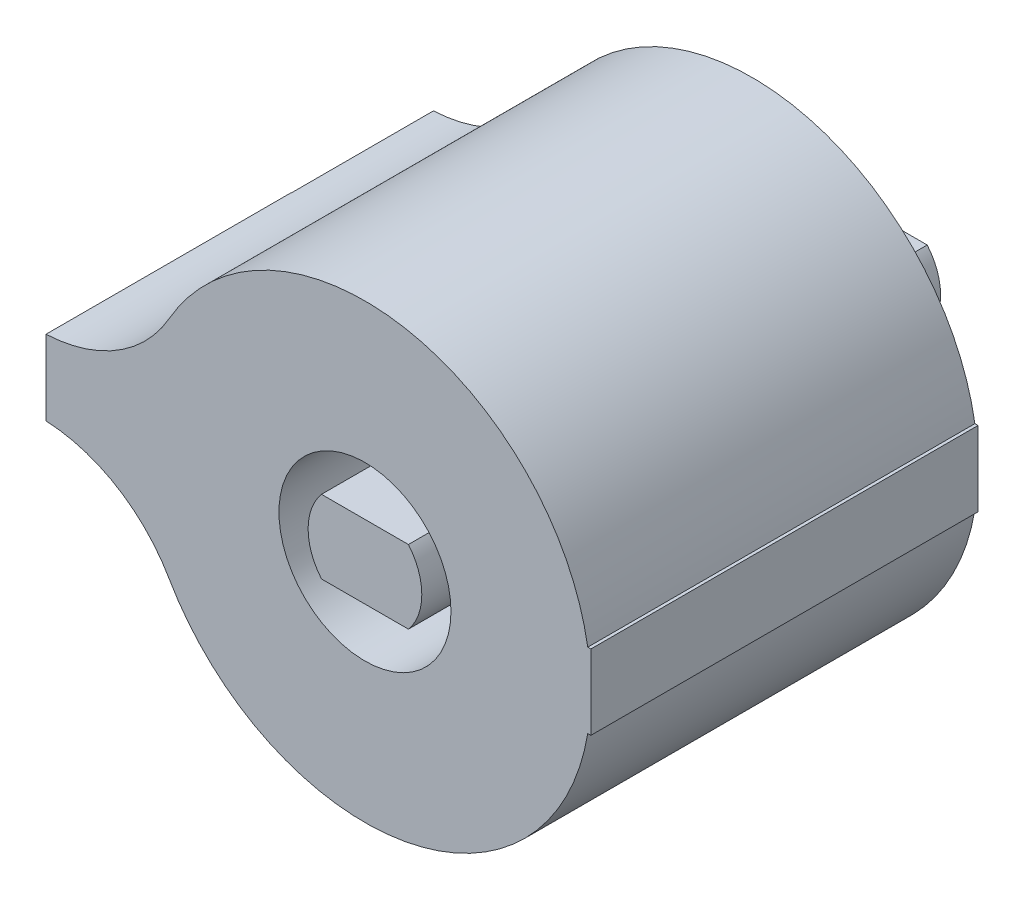
ISO-10303-21;
HEADER;
FILE_DESCRIPTION(('STEP AP214'),'2;1');
FILE_NAME('part.step','',(''),(''),'','','');
FILE_SCHEMA(('AUTOMOTIVE_DESIGN { 1 0 10303 214 1 1 1 1 }'));
ENDSEC;
DATA;
#1=APPLICATION_CONTEXT('core data for automotive mechanical design processes');
#2=APPLICATION_PROTOCOL_DEFINITION('international standard','automotive_design',2000,#1);
#3=PRODUCT_CONTEXT('',#1,'mechanical');
#4=PRODUCT('Part','Part','',(#3));
#5=PRODUCT_RELATED_PRODUCT_CATEGORY('part','',(#4));
#6=PRODUCT_DEFINITION_FORMATION('','',#4);
#7=PRODUCT_DEFINITION_CONTEXT('part definition',#1,'design');
#8=PRODUCT_DEFINITION('design','',#6,#7);
#9=PRODUCT_DEFINITION_SHAPE('','',#8);
#10=(LENGTH_UNIT() NAMED_UNIT(*) SI_UNIT(.MILLI.,.METRE.));
#11=(NAMED_UNIT(*) PLANE_ANGLE_UNIT() SI_UNIT($,.RADIAN.));
#12=(NAMED_UNIT(*) SI_UNIT($,.STERADIAN.) SOLID_ANGLE_UNIT());
#13=UNCERTAINTY_MEASURE_WITH_UNIT(LENGTH_MEASURE(1.E-05),#10,'distance_accuracy_value','');
#14=(GEOMETRIC_REPRESENTATION_CONTEXT(3) GLOBAL_UNCERTAINTY_ASSIGNED_CONTEXT((#13)) GLOBAL_UNIT_ASSIGNED_CONTEXT((#10,
#11,#12)) REPRESENTATION_CONTEXT('',''));
#15=CARTESIAN_POINT('',(0.,0.,0.));
#16=DIRECTION('',(0.,0.,1.));
#17=DIRECTION('',(1.,0.,0.));
#18=AXIS2_PLACEMENT_3D('',#15,#16,#17);
#19=CARTESIAN_POINT('',(0.,-2.45,-51.8));
#20=DIRECTION('',(0.,1.,0.));
#21=DIRECTION('',(0.,0.,1.));
#22=AXIS2_PLACEMENT_3D('',#19,#20,#21);
#23=PLANE('',#22);
#24=DIRECTION('',(0.,0.,-1.));
#25=VECTOR('',#24,1.);
#26=CARTESIAN_POINT('',(51.9952624903444,-2.45,68.1));
#27=LINE('',#26,#25);
#28=CARTESIAN_POINT('',(51.9952624903444,-2.45,-19.1233000660521));
#29=VERTEX_POINT('',#28);
#30=CARTESIAN_POINT('',(51.9952624903444,-2.45,-53.8));
#31=VERTEX_POINT('',#30);
#32=EDGE_CURVE('E98',#29,#31,#27,.T.);
#33=ORIENTED_EDGE('',*,*,#32,.T.);
#34=DIRECTION('',(-1.,0.,0.));
#35=VECTOR('',#34,1.);
#36=CARTESIAN_POINT('',(57.8047375096555,-2.45,-53.8));
#37=LINE('',#36,#35);
#38=CARTESIAN_POINT('',(57.8047375096555,-2.45,-53.8));
#39=VERTEX_POINT('',#38);
#40=EDGE_CURVE('E100',#39,#31,#37,.T.);
#41=ORIENTED_EDGE('',*,*,#40,.F.);
#42=DIRECTION('',(0.,0.,-1.));
#43=VECTOR('',#42,1.);
#44=CARTESIAN_POINT('',(57.8047375096555,-2.45,68.1));
#45=LINE('',#44,#43);
#46=CARTESIAN_POINT('',(57.8047375096555,-2.45,-19.1233000660521));
#47=VERTEX_POINT('',#46);
#48=EDGE_CURVE('E92',#47,#39,#45,.T.);
#49=ORIENTED_EDGE('',*,*,#48,.F.);
#50=DIRECTION('',(-1.,0.,0.));
#51=VECTOR('',#50,1.);
#52=CARTESIAN_POINT('',(0.,-2.45,-19.123300066052));
#53=LINE('',#52,#51);
#54=EDGE_CURVE('E73',#47,#29,#53,.T.);
#55=ORIENTED_EDGE('',*,*,#54,.T.);
#56=EDGE_LOOP('',(#33,#41,#49,#55));
#57=FACE_BOUND('',#56,.T.);
#58=ADVANCED_FACE('F54',(#57),#23,.F.);
#59=CARTESIAN_POINT('',(0.,2.45,-51.8));
#60=DIRECTION('',(0.,-1.,0.));
#61=DIRECTION('',(0.,0.,-1.));
#62=AXIS2_PLACEMENT_3D('',#59,#60,#61);
#63=PLANE('',#62);
#64=DIRECTION('',(0.,0.,-1.));
#65=VECTOR('',#64,1.);
#66=CARTESIAN_POINT('',(57.8047375096555,2.45,68.1));
#67=LINE('',#66,#65);
#68=CARTESIAN_POINT('',(57.8047375096555,2.45,-19.123300066052));
#69=VERTEX_POINT('',#68);
#70=CARTESIAN_POINT('',(57.8047375096555,2.45,-53.8));
#71=VERTEX_POINT('',#70);
#72=EDGE_CURVE('E62',#69,#71,#67,.T.);
#73=ORIENTED_EDGE('',*,*,#72,.T.);
#74=DIRECTION('',(1.,0.,0.));
#75=VECTOR('',#74,1.);
#76=CARTESIAN_POINT('',(51.9952624903444,2.45,-53.8));
#77=LINE('',#76,#75);
#78=CARTESIAN_POINT('',(51.9952624903444,2.45,-53.8));
#79=VERTEX_POINT('',#78);
#80=EDGE_CURVE('E110',#79,#71,#77,.T.);
#81=ORIENTED_EDGE('',*,*,#80,.F.);
#82=DIRECTION('',(0.,0.,-1.));
#83=VECTOR('',#82,1.);
#84=CARTESIAN_POINT('',(51.9952624903444,2.45,68.1));
#85=LINE('',#84,#83);
#86=CARTESIAN_POINT('',(51.9952624903444,2.45,-19.1233000660521));
#87=VERTEX_POINT('',#86);
#88=EDGE_CURVE('E120',#87,#79,#85,.T.);
#89=ORIENTED_EDGE('',*,*,#88,.F.);
#90=DIRECTION('',(1.,0.,0.));
#91=VECTOR('',#90,1.);
#92=CARTESIAN_POINT('',(0.,2.45,-19.123300066052));
#93=LINE('',#92,#91);
#94=EDGE_CURVE('E13',#87,#69,#93,.T.);
#95=ORIENTED_EDGE('',*,*,#94,.T.);
#96=EDGE_LOOP('',(#73,#81,#89,#95));
#97=FACE_BOUND('',#96,.T.);
#98=ADVANCED_FACE('F127',(#97),#63,.F.);
#99=CARTESIAN_POINT('',(54.9,0.,55.7480230740355));
#100=DIRECTION('',(0.,0.,-1.));
#101=DIRECTION('',(-1.,0.,0.));
#102=AXIS2_PLACEMENT_3D('',#99,#100,#101);
#103=CYLINDRICAL_SURFACE('',#102,3.8);
#104=CARTESIAN_POINT('',(54.9,0.,-19.1233000660521));
#105=DIRECTION('',(0.,0.,-1.));
#106=DIRECTION('',(-1.,0.,0.));
#107=AXIS2_PLACEMENT_3D('',#104,#105,#106);
#108=CIRCLE('',#107,3.8);
#109=EDGE_CURVE('E69',#47,#69,#108,.F.);
#110=ORIENTED_EDGE('',*,*,#109,.F.);
#111=ORIENTED_EDGE('',*,*,#48,.T.);
#112=CARTESIAN_POINT('',(54.9,0.,-53.8));
#113=DIRECTION('',(0.,0.,-1.));
#114=DIRECTION('',(-1.,0.,0.));
#115=AXIS2_PLACEMENT_3D('',#112,#113,#114);
#116=CIRCLE('',#115,3.8);
#117=EDGE_CURVE('E96',#71,#39,#116,.T.);
#118=ORIENTED_EDGE('',*,*,#117,.F.);
#119=ORIENTED_EDGE('',*,*,#72,.F.);
#120=EDGE_LOOP('',(#110,#111,#118,#119));
#121=FACE_BOUND('',#120,.T.);
#122=ADVANCED_FACE('F56',(#121),#103,.T.);
#123=CARTESIAN_POINT('',(54.9,0.,-19.1233000660521));
#124=DIRECTION('',(0.,0.,-1.));
#125=DIRECTION('',(-1.,0.,0.));
#126=AXIS2_PLACEMENT_3D('',#123,#124,#125);
#127=CIRCLE('',#126,3.8);
#128=EDGE_CURVE('E115',#87,#29,#127,.F.);
#129=ORIENTED_EDGE('',*,*,#128,.F.);
#130=ORIENTED_EDGE('',*,*,#88,.T.);
#131=CARTESIAN_POINT('',(54.9,0.,-53.8));
#132=DIRECTION('',(0.,0.,-1.));
#133=DIRECTION('',(-1.,0.,0.));
#134=AXIS2_PLACEMENT_3D('',#131,#132,#133);
#135=CIRCLE('',#134,3.8);
#136=EDGE_CURVE('E105',#31,#79,#135,.T.);
#137=ORIENTED_EDGE('',*,*,#136,.F.);
#138=ORIENTED_EDGE('',*,*,#32,.F.);
#139=EDGE_LOOP('',(#129,#130,#137,#138));
#140=FACE_BOUND('',#139,.T.);
#141=ADVANCED_FACE('F125',(#140),#103,.T.);
#142=CARTESIAN_POINT('',(-70.0000000000001,18.8472363462264,-19.123300066052));
#143=DIRECTION('',(0.,0.,-1.));
#144=DIRECTION('',(-1.,0.,0.));
#145=AXIS2_PLACEMENT_3D('',#142,#143,#144);
#146=PLANE('',#145);
#147=ORIENTED_EDGE('',*,*,#109,.T.);
#148=ORIENTED_EDGE('',*,*,#94,.F.);
#149=ORIENTED_EDGE('',*,*,#128,.T.);
#150=ORIENTED_EDGE('',*,*,#54,.F.);
#151=EDGE_LOOP('',(#147,#148,#149,#150));
#152=FACE_BOUND('',#151,.T.);
#153=ADVANCED_FACE('F128',(#152),#146,.F.);
#154=CARTESIAN_POINT('',(54.9,0.,-53.8));
#155=DIRECTION('',(0.,0.,-1.));
#156=DIRECTION('',(-1.,0.,0.));
#157=AXIS2_PLACEMENT_3D('',#154,#155,#156);
#158=PLANE('',#157);
#159=ORIENTED_EDGE('',*,*,#117,.T.);
#160=ORIENTED_EDGE('',*,*,#40,.T.);
#161=ORIENTED_EDGE('',*,*,#136,.T.);
#162=ORIENTED_EDGE('',*,*,#80,.T.);
#163=EDGE_LOOP('',(#159,#160,#161,#162));
#164=FACE_BOUND('',#163,.T.);
#165=ADVANCED_FACE('F108',(#164),#158,.T.);
#166=CLOSED_SHELL('',(#58,#98,#122,#141,#153,#165));
#167=MANIFOLD_SOLID_BREP('B2',#166);
#168=CARTESIAN_POINT('',(54.9,0.,38.));
#169=DIRECTION('',(0.,0.,1.));
#170=DIRECTION('',(1.,0.,0.));
#171=AXIS2_PLACEMENT_3D('',#168,#169,#170);
#172=CYLINDRICAL_SURFACE('',#171,15.1);
#173=CARTESIAN_POINT('',(54.9,0.,-45.));
#174=DIRECTION('',(0.,0.,1.));
#175=DIRECTION('',(1.,0.,0.));
#176=AXIS2_PLACEMENT_3D('',#173,#174,#175);
#177=CIRCLE('',#176,15.1);
#178=CARTESIAN_POINT('',(69.791608375189,2.5,-45.));
#179=VERTEX_POINT('',#178);
#180=CARTESIAN_POINT('',(41.8056959558736,7.5199203187251,-45.));
#181=VERTEX_POINT('',#180);
#182=EDGE_CURVE('E339',#179,#181,#177,.T.);
#183=ORIENTED_EDGE('',*,*,#182,.T.);
#184=DIRECTION('',(0.,0.,1.));
#185=VECTOR('',#184,1.);
#186=CARTESIAN_POINT('',(41.8056959558736,7.5199203187251,38.));
#187=LINE('',#186,#185);
#188=CARTESIAN_POINT('',(41.8056959558736,7.5199203187251,-19.123300066052));
#189=VERTEX_POINT('',#188);
#190=EDGE_CURVE('E368',#181,#189,#187,.T.);
#191=ORIENTED_EDGE('',*,*,#190,.T.);
#192=CARTESIAN_POINT('',(54.9,0.,-19.123300066052));
#193=DIRECTION('',(0.,0.,-1.));
#194=DIRECTION('',(-1.,0.,0.));
#195=AXIS2_PLACEMENT_3D('',#192,#193,#194);
#196=CIRCLE('',#195,15.1);
#197=CARTESIAN_POINT('',(69.791608375189,2.5,-19.1233000660521));
#198=VERTEX_POINT('',#197);
#199=EDGE_CURVE('E328',#198,#189,#196,.F.);
#200=ORIENTED_EDGE('',*,*,#199,.F.);
#201=DIRECTION('',(0.,0.,1.));
#202=VECTOR('',#201,1.);
#203=CARTESIAN_POINT('',(69.791608375189,2.5,38.));
#204=LINE('',#203,#202);
#205=EDGE_CURVE('E342',#198,#179,#204,.F.);
#206=ORIENTED_EDGE('',*,*,#205,.T.);
#207=EDGE_LOOP('',(#183,#191,#200,#206));
#208=FACE_BOUND('',#207,.T.);
#209=ADVANCED_FACE('F220',(#208),#172,.T.);
#210=CARTESIAN_POINT('',(0.,-2.5,0.));
#211=DIRECTION('',(0.,1.,0.));
#212=DIRECTION('',(0.,0.,1.));
#213=AXIS2_PLACEMENT_3D('',#210,#211,#212);
#214=PLANE('',#213);
#215=DIRECTION('',(0.,0.,-1.));
#216=VECTOR('',#215,1.);
#217=CARTESIAN_POINT('',(70.,-2.5,-45.));
#218=LINE('',#217,#216);
#219=CARTESIAN_POINT('',(70.,-2.5,-19.1233000660521));
#220=VERTEX_POINT('',#219);
#221=CARTESIAN_POINT('',(70.,-2.5,-45.));
#222=VERTEX_POINT('',#221);
#223=EDGE_CURVE('E346',#220,#222,#218,.T.);
#224=ORIENTED_EDGE('',*,*,#223,.F.);
#225=DIRECTION('',(-1.,0.,0.));
#226=VECTOR('',#225,1.);
#227=CARTESIAN_POINT('',(0.,-2.5,-19.123300066052));
#228=LINE('',#227,#226);
#229=CARTESIAN_POINT('',(69.791608375189,-2.5,-19.1233000660521));
#230=VERTEX_POINT('',#229);
#231=EDGE_CURVE('E318',#220,#230,#228,.T.);
#232=ORIENTED_EDGE('',*,*,#231,.T.);
#233=DIRECTION('',(0.,0.,1.));
#234=VECTOR('',#233,1.);
#235=CARTESIAN_POINT('',(69.791608375189,-2.5,38.));
#236=LINE('',#235,#234);
#237=CARTESIAN_POINT('',(69.791608375189,-2.5,-45.));
#238=VERTEX_POINT('',#237);
#239=EDGE_CURVE('E340',#230,#238,#236,.F.);
#240=ORIENTED_EDGE('',*,*,#239,.T.);
#241=DIRECTION('',(-1.,0.,0.));
#242=VECTOR('',#241,1.);
#243=CARTESIAN_POINT('',(-70.,-2.5,-45.));
#244=LINE('',#243,#242);
#245=EDGE_CURVE('E352',#222,#238,#244,.T.);
#246=ORIENTED_EDGE('',*,*,#245,.F.);
#247=EDGE_LOOP('',(#224,#232,#240,#246));
#248=FACE_BOUND('',#247,.T.);
#249=ADVANCED_FACE('F407',(#248),#214,.F.);
#250=CARTESIAN_POINT('',(0.,2.5,0.));
#251=DIRECTION('',(0.,1.,0.));
#252=DIRECTION('',(0.,0.,1.));
#253=AXIS2_PLACEMENT_3D('',#250,#251,#252);
#254=PLANE('',#253);
#255=DIRECTION('',(-1.,0.,0.));
#256=VECTOR('',#255,1.);
#257=CARTESIAN_POINT('',(0.,2.5,-19.123300066052));
#258=LINE('',#257,#256);
#259=CARTESIAN_POINT('',(70.,2.5,-19.1233000660521));
#260=VERTEX_POINT('',#259);
#261=EDGE_CURVE('E321',#260,#198,#258,.T.);
#262=ORIENTED_EDGE('',*,*,#261,.F.);
#263=DIRECTION('',(0.,0.,-1.));
#264=VECTOR('',#263,1.);
#265=CARTESIAN_POINT('',(70.,2.5,-45.));
#266=LINE('',#265,#264);
#267=CARTESIAN_POINT('',(70.,2.5,-45.));
#268=VERTEX_POINT('',#267);
#269=EDGE_CURVE('E349',#260,#268,#266,.T.);
#270=ORIENTED_EDGE('',*,*,#269,.T.);
#271=DIRECTION('',(-1.,0.,0.));
#272=VECTOR('',#271,1.);
#273=CARTESIAN_POINT('',(-70.,2.5,-45.));
#274=LINE('',#273,#272);
#275=EDGE_CURVE('E351',#268,#179,#274,.T.);
#276=ORIENTED_EDGE('',*,*,#275,.T.);
#277=ORIENTED_EDGE('',*,*,#205,.F.);
#278=EDGE_LOOP('',(#262,#270,#276,#277));
#279=FACE_BOUND('',#278,.T.);
#280=ADVANCED_FACE('F414',(#279),#254,.T.);
#281=CARTESIAN_POINT('',(-70.,2.5,-45.));
#282=DIRECTION('',(0.,0.,1.));
#283=DIRECTION('',(1.,0.,0.));
#284=AXIS2_PLACEMENT_3D('',#281,#282,#283);
#285=PLANE('',#284);
#286=CARTESIAN_POINT('',(54.9,0.,-45.));
#287=DIRECTION('',(0.,0.,1.));
#288=DIRECTION('',(1.,0.,0.));
#289=AXIS2_PLACEMENT_3D('',#286,#287,#288);
#290=CIRCLE('',#289,11.1);
#291=CARTESIAN_POINT('',(66.,0.,-45.));
#292=VERTEX_POINT('',#291);
#293=EDGE_CURVE('E333',#292,#292,#290,.T.);
#294=ORIENTED_EDGE('',*,*,#293,.T.);
#295=EDGE_LOOP('',(#294));
#296=FACE_BOUND('',#295,.T.);
#297=DIRECTION('',(0.,-1.,0.));
#298=VECTOR('',#297,1.);
#299=CARTESIAN_POINT('',(70.,2.5,-45.));
#300=LINE('',#299,#298);
#301=EDGE_CURVE('E355',#268,#222,#300,.T.);
#302=ORIENTED_EDGE('',*,*,#301,.T.);
#303=ORIENTED_EDGE('',*,*,#245,.T.);
#304=CARTESIAN_POINT('',(41.8056959558736,-7.5199203187251,-45.));
#305=VERTEX_POINT('',#304);
#306=EDGE_CURVE('E336',#305,#238,#177,.T.);
#307=ORIENTED_EDGE('',*,*,#306,.F.);
#308=CARTESIAN_POINT('',(33.1339714233395,-12.5,-45.));
#309=DIRECTION('',(0.,0.,1.));
#310=DIRECTION('',(1.,0.,0.));
#311=AXIS2_PLACEMENT_3D('',#308,#309,#310);
#312=CIRCLE('',#311,10.);
#313=CARTESIAN_POINT('',(33.5999999999999,-2.51086503416157,-45.));
#314=VERTEX_POINT('',#313);
#315=EDGE_CURVE('E371',#305,#314,#312,.T.);
#316=ORIENTED_EDGE('',*,*,#315,.T.);
#317=DIRECTION('',(0.,1.,0.));
#318=VECTOR('',#317,1.);
#319=CARTESIAN_POINT('',(33.5999999999999,-15.401,-45.));
#320=LINE('',#319,#318);
#321=CARTESIAN_POINT('',(33.5999999999999,2.51086503416157,-45.));
#322=VERTEX_POINT('',#321);
#323=EDGE_CURVE('E242',#314,#322,#320,.T.);
#324=ORIENTED_EDGE('',*,*,#323,.T.);
#325=CARTESIAN_POINT('',(33.1339714233395,12.5,-45.));
#326=DIRECTION('',(0.,0.,1.));
#327=DIRECTION('',(1.,0.,0.));
#328=AXIS2_PLACEMENT_3D('',#325,#326,#327);
#329=CIRCLE('',#328,10.);
#330=EDGE_CURVE('E228',#322,#181,#329,.T.);
#331=ORIENTED_EDGE('',*,*,#330,.T.);
#332=ORIENTED_EDGE('',*,*,#182,.F.);
#333=ORIENTED_EDGE('',*,*,#275,.F.);
#334=EDGE_LOOP('',(#302,#303,#307,#316,#324,#331,#332,#333));
#335=FACE_BOUND('',#334,.T.);
#336=ADVANCED_FACE('F385',(#296,#335),#285,.F.);
#337=CARTESIAN_POINT('',(70.,2.5,-45.));
#338=DIRECTION('',(-1.,0.,0.));
#339=DIRECTION('',(0.,0.,1.));
#340=AXIS2_PLACEMENT_3D('',#337,#338,#339);
#341=PLANE('',#340);
#342=ORIENTED_EDGE('',*,*,#269,.F.);
#343=DIRECTION('',(0.,-1.,0.));
#344=VECTOR('',#343,1.);
#345=CARTESIAN_POINT('',(70.,2.5,-19.1233000660521));
#346=LINE('',#345,#344);
#347=EDGE_CURVE('E325',#260,#220,#346,.T.);
#348=ORIENTED_EDGE('',*,*,#347,.T.);
#349=ORIENTED_EDGE('',*,*,#223,.T.);
#350=ORIENTED_EDGE('',*,*,#301,.F.);
#351=EDGE_LOOP('',(#342,#348,#349,#350));
#352=FACE_BOUND('',#351,.T.);
#353=ADVANCED_FACE('F411',(#352),#341,.F.);
#354=CARTESIAN_POINT('',(-104.930836107127,4.,-35.5));
#355=DIRECTION('',(0.,0.,-1.));
#356=DIRECTION('',(0.,1.,0.));
#357=AXIS2_PLACEMENT_3D('',#354,#355,#356);
#358=PLANE('',#357);
#359=DIRECTION('',(0.,-1.,0.));
#360=VECTOR('',#359,1.);
#361=CARTESIAN_POINT('',(33.5800001469714,3.99999999999998,-35.5));
#362=LINE('',#361,#360);
#363=CARTESIAN_POINT('',(33.5800001469714,2.50995203326354,-35.5));
#364=VERTEX_POINT('',#363);
#365=CARTESIAN_POINT('',(33.5800001469714,-2.50995203326354,-35.5));
#366=VERTEX_POINT('',#365);
#367=EDGE_CURVE('E297',#364,#366,#362,.T.);
#368=ORIENTED_EDGE('',*,*,#367,.F.);
#369=CARTESIAN_POINT('',(33.1339714233395,12.5,-35.5));
#370=DIRECTION('',(0.,0.,-1.));
#371=DIRECTION('',(0.,1.,0.));
#372=AXIS2_PLACEMENT_3D('',#369,#370,#371);
#373=CIRCLE('',#372,10.);
#374=CARTESIAN_POINT('',(33.5999999999999,2.51086503416157,-35.5));
#375=VERTEX_POINT('',#374);
#376=EDGE_CURVE('E379',#364,#375,#373,.F.);
#377=ORIENTED_EDGE('',*,*,#376,.T.);
#378=DIRECTION('',(0.,1.,0.));
#379=VECTOR('',#378,1.);
#380=CARTESIAN_POINT('',(33.5999999999999,-15.401,-35.5));
#381=LINE('',#380,#379);
#382=CARTESIAN_POINT('',(33.5999999999999,-2.51086503416157,-35.5));
#383=VERTEX_POINT('',#382);
#384=EDGE_CURVE('E344',#383,#375,#381,.T.);
#385=ORIENTED_EDGE('',*,*,#384,.F.);
#386=CARTESIAN_POINT('',(33.1339714233395,-12.5,-35.5));
#387=DIRECTION('',(0.,0.,-1.));
#388=DIRECTION('',(0.,1.,0.));
#389=AXIS2_PLACEMENT_3D('',#386,#387,#388);
#390=CIRCLE('',#389,10.);
#391=EDGE_CURVE('E376',#383,#366,#390,.F.);
#392=ORIENTED_EDGE('',*,*,#391,.T.);
#393=EDGE_LOOP('',(#368,#377,#385,#392));
#394=FACE_BOUND('',#393,.T.);
#395=ADVANCED_FACE('F395',(#394),#358,.T.);
#396=CARTESIAN_POINT('',(33.5999999999999,-15.401,-35.5));
#397=DIRECTION('',(-1.,0.,0.));
#398=DIRECTION('',(0.,0.,1.));
#399=AXIS2_PLACEMENT_3D('',#396,#397,#398);
#400=PLANE('',#399);
#401=ORIENTED_EDGE('',*,*,#384,.T.);
#402=DIRECTION('',(0.,0.,1.));
#403=VECTOR('',#402,1.);
#404=CARTESIAN_POINT('',(33.5999999999999,2.51086503416157,-35.5));
#405=LINE('',#404,#403);
#406=EDGE_CURVE('E381',#375,#322,#405,.F.);
#407=ORIENTED_EDGE('',*,*,#406,.T.);
#408=ORIENTED_EDGE('',*,*,#323,.F.);
#409=DIRECTION('',(0.,0.,1.));
#410=VECTOR('',#409,1.);
#411=CARTESIAN_POINT('',(33.5999999999999,-2.51086503416157,-45.));
#412=LINE('',#411,#410);
#413=EDGE_CURVE('E373',#314,#383,#412,.T.);
#414=ORIENTED_EDGE('',*,*,#413,.T.);
#415=EDGE_LOOP('',(#401,#407,#408,#414));
#416=FACE_BOUND('',#415,.T.);
#417=ADVANCED_FACE('F399',(#416),#400,.T.);
#418=CARTESIAN_POINT('',(54.9,0.,38.));
#419=DIRECTION('',(0.,0.,1.));
#420=DIRECTION('',(1.,0.,0.));
#421=AXIS2_PLACEMENT_3D('',#418,#419,#420);
#422=CYLINDRICAL_SURFACE('',#421,11.1);
#423=CARTESIAN_POINT('',(54.9,0.,-38.));
#424=DIRECTION('',(0.,0.,-1.));
#425=DIRECTION('',(-1.,0.,0.));
#426=AXIS2_PLACEMENT_3D('',#423,#424,#425);
#427=CIRCLE('',#426,11.1);
#428=CARTESIAN_POINT('',(43.8,0.,-38.));
#429=VERTEX_POINT('',#428);
#430=EDGE_CURVE('E330',#429,#429,#427,.T.);
#431=ORIENTED_EDGE('',*,*,#430,.F.);
#432=EDGE_LOOP('',(#431));
#433=FACE_BOUND('',#432,.T.);
#434=ORIENTED_EDGE('',*,*,#293,.F.);
#435=EDGE_LOOP('',(#434));
#436=FACE_BOUND('',#435,.T.);
#437=ADVANCED_FACE('F433',(#433,#436),#422,.F.);
#438=CARTESIAN_POINT('',(54.9,0.,-19.1233000660521));
#439=DIRECTION('',(0.,0.,-1.));
#440=DIRECTION('',(-1.,0.,0.));
#441=AXIS2_PLACEMENT_3D('',#438,#439,#440);
#442=CIRCLE('',#441,15.1);
#443=CARTESIAN_POINT('',(41.8056959558736,-7.5199203187251,-19.1233000660521));
#444=VERTEX_POINT('',#443);
#445=EDGE_CURVE('E316',#444,#230,#442,.F.);
#446=ORIENTED_EDGE('',*,*,#445,.F.);
#447=DIRECTION('',(0.,0.,1.));
#448=VECTOR('',#447,1.);
#449=CARTESIAN_POINT('',(41.8056959558736,-7.5199203187251,38.));
#450=LINE('',#449,#448);
#451=EDGE_CURVE('E315',#444,#305,#450,.F.);
#452=ORIENTED_EDGE('',*,*,#451,.T.);
#453=ORIENTED_EDGE('',*,*,#306,.T.);
#454=ORIENTED_EDGE('',*,*,#239,.F.);
#455=EDGE_LOOP('',(#446,#452,#453,#454));
#456=FACE_BOUND('',#455,.T.);
#457=ADVANCED_FACE('F404',(#456),#172,.T.);
#458=CARTESIAN_POINT('',(54.9,0.,-38.));
#459=DIRECTION('',(0.,0.,-1.));
#460=DIRECTION('',(1.,0.,0.));
#461=AXIS2_PLACEMENT_3D('',#458,#459,#460);
#462=PLANE('',#461);
#463=ORIENTED_EDGE('',*,*,#430,.T.);
#464=EDGE_LOOP('',(#463));
#465=FACE_BOUND('',#464,.T.);
#466=CARTESIAN_POINT('',(54.9,0.,-38.));
#467=DIRECTION('',(0.,0.,-1.));
#468=DIRECTION('',(-1.,0.,0.));
#469=AXIS2_PLACEMENT_3D('',#466,#467,#468);
#470=CIRCLE('',#469,5.75);
#471=CARTESIAN_POINT('',(60.65,0.,-38.));
#472=VERTEX_POINT('',#471);
#473=EDGE_CURVE('E361',#472,#472,#470,.T.);
#474=ORIENTED_EDGE('',*,*,#473,.F.);
#475=EDGE_LOOP('',(#474));
#476=FACE_BOUND('',#475,.T.);
#477=ADVANCED_FACE('F432',(#465,#476),#462,.T.);
#478=CARTESIAN_POINT('',(54.9,0.,-54.2634559672906));
#479=DIRECTION('',(0.,0.,1.));
#480=DIRECTION('',(1.,0.,0.));
#481=AXIS2_PLACEMENT_3D('',#478,#479,#480);
#482=CYLINDRICAL_SURFACE('',#481,5.75);
#483=CARTESIAN_POINT('',(54.9,0.,-19.123300066052));
#484=DIRECTION('',(0.,0.,-1.));
#485=DIRECTION('',(-1.,0.,0.));
#486=AXIS2_PLACEMENT_3D('',#483,#484,#485);
#487=CIRCLE('',#486,5.75);
#488=CARTESIAN_POINT('',(60.65,0.,-19.1233000660521));
#489=VERTEX_POINT('',#488);
#490=EDGE_CURVE('E364',#489,#489,#487,.F.);
#491=CARTESIAN_POINT('',(60.65,0.,-19.1233000660521));
#492=CARTESIAN_POINT('',(60.65,0.,-19.3199323570307));
#493=CARTESIAN_POINT('',(60.65,0.,-19.5165646480093));
#494=CARTESIAN_POINT('',(60.65,0.,-19.9098292299666));
#495=CARTESIAN_POINT('',(60.65,0.,-20.1064615209452));
#496=CARTESIAN_POINT('',(60.65,0.,-20.4997261029024));
#497=CARTESIAN_POINT('',(60.65,0.,-20.6963583938811));
#498=CARTESIAN_POINT('',(60.65,0.,-21.0896229758383));
#499=CARTESIAN_POINT('',(60.65,0.,-21.2862552668169));
#500=CARTESIAN_POINT('',(60.65,0.,-21.6795198487742));
#501=CARTESIAN_POINT('',(60.65,0.,-21.8761521397528));
#502=CARTESIAN_POINT('',(60.65,0.,-22.26941672171));
#503=CARTESIAN_POINT('',(60.65,0.,-22.4660490126887));
#504=CARTESIAN_POINT('',(60.65,0.,-22.8593135946459));
#505=CARTESIAN_POINT('',(60.65,0.,-23.0559458856245));
#506=CARTESIAN_POINT('',(60.65,0.,-23.4492104675818));
#507=CARTESIAN_POINT('',(60.65,0.,-23.6458427585604));
#508=CARTESIAN_POINT('',(60.65,0.,-24.0391073405177));
#509=CARTESIAN_POINT('',(60.65,0.,-24.2357396314963));
#510=CARTESIAN_POINT('',(60.65,0.,-24.6290042134535));
#511=CARTESIAN_POINT('',(60.65,0.,-24.8256365044322));
#512=CARTESIAN_POINT('',(60.65,0.,-25.2189010863894));
#513=CARTESIAN_POINT('',(60.65,0.,-25.415533377368));
#514=CARTESIAN_POINT('',(60.65,0.,-25.8087979593253));
#515=CARTESIAN_POINT('',(60.65,0.,-26.0054302503039));
#516=CARTESIAN_POINT('',(60.65,0.,-26.3986948322612));
#517=CARTESIAN_POINT('',(60.65,0.,-26.5953271232398));
#518=CARTESIAN_POINT('',(60.65,0.,-26.988591705197));
#519=CARTESIAN_POINT('',(60.65,0.,-27.1852239961757));
#520=CARTESIAN_POINT('',(60.65,0.,-27.5784885781329));
#521=CARTESIAN_POINT('',(60.65,0.,-27.7751208691115));
#522=CARTESIAN_POINT('',(60.65,0.,-28.1683854510688));
#523=CARTESIAN_POINT('',(60.65,0.,-28.3650177420474));
#524=CARTESIAN_POINT('',(60.65,0.,-28.7582823240047));
#525=CARTESIAN_POINT('',(60.65,0.,-28.9549146149833));
#526=CARTESIAN_POINT('',(60.65,0.,-29.3481791969405));
#527=CARTESIAN_POINT('',(60.65,0.,-29.5448114879192));
#528=CARTESIAN_POINT('',(60.65,0.,-29.9380760698764));
#529=CARTESIAN_POINT('',(60.65,0.,-30.134708360855));
#530=CARTESIAN_POINT('',(60.65,0.,-30.5279729428123));
#531=CARTESIAN_POINT('',(60.65,0.,-30.7246052337909));
#532=CARTESIAN_POINT('',(60.65,0.,-31.1178698157481));
#533=CARTESIAN_POINT('',(60.65,0.,-31.3145021067268));
#534=CARTESIAN_POINT('',(60.65,0.,-31.707766688684));
#535=CARTESIAN_POINT('',(60.65,0.,-31.9043989796626));
#536=CARTESIAN_POINT('',(60.65,0.,-32.2976635616199));
#537=CARTESIAN_POINT('',(60.65,0.,-32.4942958525985));
#538=CARTESIAN_POINT('',(60.65,0.,-32.8875604345558));
#539=CARTESIAN_POINT('',(60.65,0.,-33.0841927255344));
#540=CARTESIAN_POINT('',(60.65,0.,-33.4774573074916));
#541=CARTESIAN_POINT('',(60.65,0.,-33.6740895984703));
#542=CARTESIAN_POINT('',(60.65,0.,-34.0673541804275));
#543=CARTESIAN_POINT('',(60.65,0.,-34.2639864714061));
#544=CARTESIAN_POINT('',(60.65,0.,-34.6572510533634));
#545=CARTESIAN_POINT('',(60.65,0.,-34.853883344342));
#546=CARTESIAN_POINT('',(60.65,0.,-35.2471479262993));
#547=CARTESIAN_POINT('',(60.65,0.,-35.4437802172779));
#548=CARTESIAN_POINT('',(60.65,0.,-35.8370447992351));
#549=CARTESIAN_POINT('',(60.65,0.,-36.0336770902138));
#550=CARTESIAN_POINT('',(60.65,0.,-36.426941672171));
#551=CARTESIAN_POINT('',(60.65,0.,-36.6235739631496));
#552=CARTESIAN_POINT('',(60.65,0.,-37.0168385451069));
#553=CARTESIAN_POINT('',(60.65,0.,-37.2134708360855));
#554=CARTESIAN_POINT('',(60.65,0.,-37.6067354180428));
#555=CARTESIAN_POINT('',(60.65,0.,-37.8033677090214));
#556=CARTESIAN_POINT('',(60.65,0.,-38.));
#557=B_SPLINE_CURVE_WITH_KNOTS('',3,(#491,#492,#493,#494,#495,#496,#497,#498,#499,#500,#501,
#502,#503,#504,#505,#506,#507,#508,#509,#510,#511,#512,#513,#514,#515,#516,#517,#518,#519,#520,
#521,#522,#523,#524,#525,#526,#527,#528,#529,#530,#531,#532,#533,#534,#535,#536,#537,#538,#539,
#540,#541,#542,#543,#544,#545,#546,#547,#548,#549,#550,#551,#552,#553,#554,#555,#556),
.UNSPECIFIED.,.F.,.F.,(4,2,2,2,2,2,2,2,2,2,2,2,2,2,2,2,2,2,2,2,2,2,2,2,2,2,2,2,2,2,2,2,4),(0.,
0.589896872935876,1.17979374587174,1.76969061880762,2.3595874917435,2.94948436467937,
3.53938123761524,4.12927811055111,4.71917498348698,5.30907185642286,5.89896872935873,
6.4888656022946,7.07876247523048,7.66865934816635,8.25855622110222,8.8484530940381,
9.43834996697397,10.0282468399098,10.6181437128457,11.2080405857816,11.7979374587175,
12.3878343316533,12.9777312045892,13.5676280775251,14.157524950461,14.7474218233968,
15.3373186963327,15.9272155692686,16.5171124422045,17.1070093151403,17.6969061880762,
18.2868030610121,18.876699933948),.UNSPECIFIED.);
#558=EDGE_CURVE('BSEAM438',#489,#472,#557,.T.);
#559=ORIENTED_EDGE('',*,*,#490,.T.);
#560=ORIENTED_EDGE('',*,*,#473,.T.);
#561=ORIENTED_EDGE('',*,*,#558,.T.);
#562=ORIENTED_EDGE('',*,*,#558,.F.);
#563=EDGE_LOOP('',(#559,#561,#560,#562));
#564=FACE_BOUND('',#563,.T.);
#565=ADVANCED_FACE('F438',(#564),#482,.F.);
#566=CARTESIAN_POINT('',(70.,2.5,-19.123300066052));
#567=DIRECTION('',(0.,0.,-1.));
#568=DIRECTION('',(-1.,0.,0.));
#569=AXIS2_PLACEMENT_3D('',#566,#567,#568);
#570=PLANE('',#569);
#571=CARTESIAN_POINT('',(33.1339714233395,12.5,-19.123300066052));
#572=DIRECTION('',(0.,0.,-1.));
#573=DIRECTION('',(-1.,0.,0.));
#574=AXIS2_PLACEMENT_3D('',#571,#572,#573);
#575=CIRCLE('',#574,10.);
#576=CARTESIAN_POINT('',(33.5800001469714,2.50995203326354,-19.123300066052));
#577=VERTEX_POINT('',#576);
#578=EDGE_CURVE('E310',#189,#577,#575,.T.);
#579=ORIENTED_EDGE('',*,*,#578,.T.);
#580=DIRECTION('',(0.,-1.,0.));
#581=VECTOR('',#580,1.);
#582=CARTESIAN_POINT('',(33.5800001469714,21.382136845721,-19.123300066052));
#583=LINE('',#582,#581);
#584=CARTESIAN_POINT('',(33.5800001469714,-2.50995203326354,-19.123300066052));
#585=VERTEX_POINT('',#584);
#586=EDGE_CURVE('E235',#577,#585,#583,.T.);
#587=ORIENTED_EDGE('',*,*,#586,.T.);
#588=CARTESIAN_POINT('',(33.1339714233395,-12.5,-19.123300066052));
#589=DIRECTION('',(0.,0.,-1.));
#590=DIRECTION('',(-1.,0.,0.));
#591=AXIS2_PLACEMENT_3D('',#588,#589,#590);
#592=CIRCLE('',#591,10.);
#593=EDGE_CURVE('E302',#444,#585,#592,.F.);
#594=ORIENTED_EDGE('',*,*,#593,.F.);
#595=ORIENTED_EDGE('',*,*,#445,.T.);
#596=ORIENTED_EDGE('',*,*,#231,.F.);
#597=ORIENTED_EDGE('',*,*,#347,.F.);
#598=ORIENTED_EDGE('',*,*,#261,.T.);
#599=ORIENTED_EDGE('',*,*,#199,.T.);
#600=EDGE_LOOP('',(#579,#587,#594,#595,#596,#597,#598,#599));
#601=FACE_BOUND('',#600,.T.);
#602=ORIENTED_EDGE('',*,*,#490,.F.);
#603=EDGE_LOOP('',(#602));
#604=FACE_BOUND('',#603,.T.);
#605=ADVANCED_FACE('F306',(#601,#604),#570,.F.);
#606=CARTESIAN_POINT('',(33.1339714233395,-12.5,38.));
#607=DIRECTION('',(0.,0.,1.));
#608=DIRECTION('',(1.,0.,0.));
#609=AXIS2_PLACEMENT_3D('',#606,#607,#608);
#610=CYLINDRICAL_SURFACE('',#609,10.);
#611=ORIENTED_EDGE('',*,*,#593,.T.);
#612=DIRECTION('',(0.,0.,1.));
#613=VECTOR('',#612,1.);
#614=CARTESIAN_POINT('',(33.5800001469714,-2.50995203326354,38.));
#615=LINE('',#614,#613);
#616=EDGE_CURVE('E294',#585,#366,#615,.F.);
#617=ORIENTED_EDGE('',*,*,#616,.T.);
#618=ORIENTED_EDGE('',*,*,#391,.F.);
#619=ORIENTED_EDGE('',*,*,#413,.F.);
#620=ORIENTED_EDGE('',*,*,#315,.F.);
#621=ORIENTED_EDGE('',*,*,#451,.F.);
#622=EDGE_LOOP('',(#611,#617,#618,#619,#620,#621));
#623=FACE_BOUND('',#622,.T.);
#624=ADVANCED_FACE('F313',(#623),#610,.F.);
#625=CARTESIAN_POINT('',(33.1339714233395,12.5,38.));
#626=DIRECTION('',(0.,0.,1.));
#627=DIRECTION('',(1.,0.,0.));
#628=AXIS2_PLACEMENT_3D('',#625,#626,#627);
#629=CYLINDRICAL_SURFACE('',#628,10.);
#630=ORIENTED_EDGE('',*,*,#376,.F.);
#631=DIRECTION('',(0.,0.,1.));
#632=VECTOR('',#631,1.);
#633=CARTESIAN_POINT('',(33.5800001469714,2.50995203326354,38.));
#634=LINE('',#633,#632);
#635=EDGE_CURVE('E52',#364,#577,#634,.T.);
#636=ORIENTED_EDGE('',*,*,#635,.T.);
#637=ORIENTED_EDGE('',*,*,#578,.F.);
#638=ORIENTED_EDGE('',*,*,#190,.F.);
#639=ORIENTED_EDGE('',*,*,#330,.F.);
#640=ORIENTED_EDGE('',*,*,#406,.F.);
#641=EDGE_LOOP('',(#630,#636,#637,#638,#639,#640));
#642=FACE_BOUND('',#641,.T.);
#643=ADVANCED_FACE('F222',(#642),#629,.F.);
#644=CARTESIAN_POINT('',(33.5800001469714,21.382136845721,-19.123300066052));
#645=DIRECTION('',(1.,0.,0.));
#646=DIRECTION('',(0.,0.,-1.));
#647=AXIS2_PLACEMENT_3D('',#644,#645,#646);
#648=PLANE('',#647);
#649=ORIENTED_EDGE('',*,*,#586,.F.);
#650=ORIENTED_EDGE('',*,*,#635,.F.);
#651=ORIENTED_EDGE('',*,*,#367,.T.);
#652=ORIENTED_EDGE('',*,*,#616,.F.);
#653=EDGE_LOOP('',(#649,#650,#651,#652));
#654=FACE_BOUND('',#653,.T.);
#655=ADVANCED_FACE('F295',(#654),#648,.F.);
#656=CLOSED_SHELL('',(#209,#249,#280,#336,#353,#395,#417,#437,#457,#477,#565,#605,#624,#643,#655));
#657=MANIFOLD_SOLID_BREP('B7',#656);
#658=ADVANCED_BREP_SHAPE_REPRESENTATION('',(#18,#167,#657),#14);
#659=SHAPE_DEFINITION_REPRESENTATION(#9,#658);
ENDSEC;
END-ISO-10303-21;
